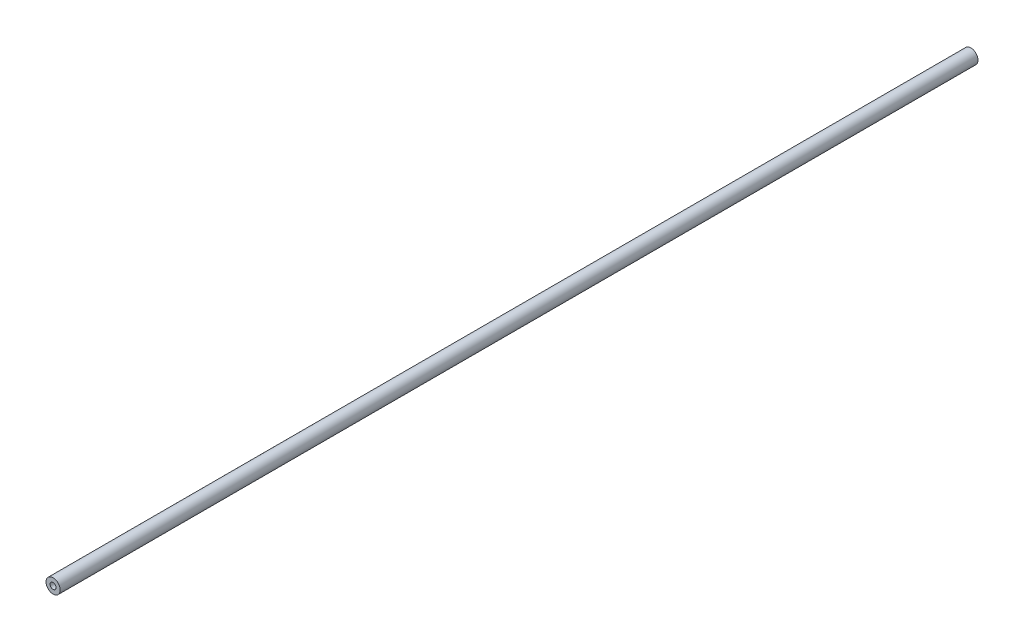
ISO-10303-21;
HEADER;
FILE_DESCRIPTION(('STEP AP214'),'2;1');
FILE_NAME('part.step','',(''),(''),'','','');
FILE_SCHEMA(('AUTOMOTIVE_DESIGN { 1 0 10303 214 1 1 1 1 }'));
ENDSEC;
DATA;
#1=APPLICATION_CONTEXT('core data for automotive mechanical design processes');
#2=APPLICATION_PROTOCOL_DEFINITION('international standard','automotive_design',2000,#1);
#3=PRODUCT_CONTEXT('',#1,'mechanical');
#4=PRODUCT('Part','Part','',(#3));
#5=PRODUCT_RELATED_PRODUCT_CATEGORY('part','',(#4));
#6=PRODUCT_DEFINITION_FORMATION('','',#4);
#7=PRODUCT_DEFINITION_CONTEXT('part definition',#1,'design');
#8=PRODUCT_DEFINITION('design','',#6,#7);
#9=PRODUCT_DEFINITION_SHAPE('','',#8);
#10=(LENGTH_UNIT() NAMED_UNIT(*) SI_UNIT(.MILLI.,.METRE.));
#11=(NAMED_UNIT(*) PLANE_ANGLE_UNIT() SI_UNIT($,.RADIAN.));
#12=(NAMED_UNIT(*) SI_UNIT($,.STERADIAN.) SOLID_ANGLE_UNIT());
#13=UNCERTAINTY_MEASURE_WITH_UNIT(LENGTH_MEASURE(1.E-05),#10,'distance_accuracy_value','');
#14=(GEOMETRIC_REPRESENTATION_CONTEXT(3) GLOBAL_UNCERTAINTY_ASSIGNED_CONTEXT((#13)) GLOBAL_UNIT_ASSIGNED_CONTEXT((#10,
#11,#12)) REPRESENTATION_CONTEXT('',''));
#15=CARTESIAN_POINT('',(0.,0.,0.));
#16=DIRECTION('',(0.,0.,1.));
#17=DIRECTION('',(1.,0.,0.));
#18=AXIS2_PLACEMENT_3D('',#15,#16,#17);
#19=CARTESIAN_POINT('',(0.,0.,-615.95));
#20=DIRECTION('',(0.,0.,1.));
#21=DIRECTION('',(1.,0.,0.));
#22=AXIS2_PLACEMENT_3D('',#19,#20,#21);
#23=PLANE('',#22);
#24=CARTESIAN_POINT('',(0.,0.,-615.95));
#25=DIRECTION('',(0.,0.,1.));
#26=DIRECTION('',(1.,0.,0.));
#27=AXIS2_PLACEMENT_3D('',#24,#25,#26);
#28=CIRCLE('',#27,4.7625);
#29=CARTESIAN_POINT('',(4.7625,0.,-615.95));
#30=VERTEX_POINT('',#29);
#31=EDGE_CURVE('E11',#30,#30,#28,.T.);
#32=ORIENTED_EDGE('',*,*,#31,.F.);
#33=EDGE_LOOP('',(#32));
#34=FACE_BOUND('',#33,.T.);
#35=CARTESIAN_POINT('',(0.,0.,-615.95));
#36=DIRECTION('',(0.,0.,-1.));
#37=DIRECTION('',(-1.,0.,0.));
#38=AXIS2_PLACEMENT_3D('',#35,#36,#37);
#39=CIRCLE('',#38,2.0193);
#40=CARTESIAN_POINT('',(-2.0193,0.,-615.95));
#41=VERTEX_POINT('',#40);
#42=EDGE_CURVE('E81',#41,#41,#39,.T.);
#43=ORIENTED_EDGE('',*,*,#42,.F.);
#44=EDGE_LOOP('',(#43));
#45=FACE_BOUND('',#44,.T.);
#46=ADVANCED_FACE('F55',(#34,#45),#23,.F.);
#47=CARTESIAN_POINT('',(0.,0.,-615.95));
#48=DIRECTION('',(0.,0.,1.));
#49=DIRECTION('',(1.,0.,0.));
#50=AXIS2_PLACEMENT_3D('',#47,#48,#49);
#51=CYLINDRICAL_SURFACE('',#50,4.7625);
#52=ORIENTED_EDGE('',*,*,#31,.T.);
#53=EDGE_LOOP('',(#52));
#54=FACE_BOUND('',#53,.T.);
#55=CARTESIAN_POINT('',(0.,0.,0.));
#56=DIRECTION('',(0.,0.,1.));
#57=DIRECTION('',(1.,0.,0.));
#58=AXIS2_PLACEMENT_3D('',#55,#56,#57);
#59=CIRCLE('',#58,4.7625);
#60=CARTESIAN_POINT('',(4.7625,0.,0.));
#61=VERTEX_POINT('',#60);
#62=EDGE_CURVE('E59',#61,#61,#59,.T.);
#63=ORIENTED_EDGE('',*,*,#62,.F.);
#64=EDGE_LOOP('',(#63));
#65=FACE_BOUND('',#64,.T.);
#66=ADVANCED_FACE('F57',(#54,#65),#51,.T.);
#67=CARTESIAN_POINT('',(0.,0.,0.));
#68=DIRECTION('',(0.,0.,1.));
#69=DIRECTION('',(1.,0.,0.));
#70=AXIS2_PLACEMENT_3D('',#67,#68,#69);
#71=PLANE('',#70);
#72=CARTESIAN_POINT('',(0.,0.,0.));
#73=DIRECTION('',(0.,0.,1.));
#74=DIRECTION('',(1.,0.,0.));
#75=AXIS2_PLACEMENT_3D('',#72,#73,#74);
#76=CIRCLE('',#75,2.0193);
#77=CARTESIAN_POINT('',(2.0193,0.,0.));
#78=VERTEX_POINT('',#77);
#79=EDGE_CURVE('E82',#78,#78,#76,.T.);
#80=ORIENTED_EDGE('',*,*,#79,.F.);
#81=EDGE_LOOP('',(#80));
#82=FACE_BOUND('',#81,.T.);
#83=ORIENTED_EDGE('',*,*,#62,.T.);
#84=EDGE_LOOP('',(#83));
#85=FACE_BOUND('',#84,.T.);
#86=ADVANCED_FACE('F100',(#82,#85),#71,.T.);
#87=CARTESIAN_POINT('',(0.,0.,-596.9));
#88=DIRECTION('',(0.,0.,-1.));
#89=DIRECTION('',(-1.,0.,0.));
#90=AXIS2_PLACEMENT_3D('',#87,#88,#89);
#91=CONICAL_SURFACE('',#90,2.0193,1.02974425867664);
#92=CARTESIAN_POINT('',(0.,0.,-595.686682151998));
#93=VERTEX_POINT('',#92);
#94=VERTEX_LOOP('',#93);
#95=FACE_BOUND('',#94,.T.);
#96=CARTESIAN_POINT('',(0.,0.,-596.9));
#97=DIRECTION('',(0.,0.,-1.));
#98=DIRECTION('',(-1.,0.,0.));
#99=AXIS2_PLACEMENT_3D('',#96,#97,#98);
#100=CIRCLE('',#99,2.0193);
#101=CARTESIAN_POINT('',(-2.0193,0.,-596.9));
#102=VERTEX_POINT('',#101);
#103=EDGE_CURVE('E87',#102,#102,#100,.T.);
#104=ORIENTED_EDGE('',*,*,#103,.T.);
#105=EDGE_LOOP('',(#104));
#106=FACE_BOUND('',#105,.T.);
#107=ADVANCED_FACE('F108',(#95,#106),#91,.F.);
#108=CARTESIAN_POINT('',(0.,0.,-615.95));
#109=DIRECTION('',(0.,0.,-1.));
#110=DIRECTION('',(-1.,0.,0.));
#111=AXIS2_PLACEMENT_3D('',#108,#109,#110);
#112=CYLINDRICAL_SURFACE('',#111,2.0193);
#113=ORIENTED_EDGE('',*,*,#103,.F.);
#114=EDGE_LOOP('',(#113));
#115=FACE_BOUND('',#114,.T.);
#116=ORIENTED_EDGE('',*,*,#42,.T.);
#117=EDGE_LOOP('',(#116));
#118=FACE_BOUND('',#117,.T.);
#119=ADVANCED_FACE('F74',(#115,#118),#112,.F.);
#120=CARTESIAN_POINT('',(0.,0.,-19.05));
#121=DIRECTION('',(0.,0.,1.));
#122=DIRECTION('',(1.,0.,0.));
#123=AXIS2_PLACEMENT_3D('',#120,#121,#122);
#124=CONICAL_SURFACE('',#123,2.0193,1.02974425867665);
#125=CARTESIAN_POINT('',(0.,0.,-20.2633178480024));
#126=VERTEX_POINT('',#125);
#127=VERTEX_LOOP('',#126);
#128=FACE_BOUND('',#127,.T.);
#129=CARTESIAN_POINT('',(0.,0.,-19.05));
#130=DIRECTION('',(0.,0.,1.));
#131=DIRECTION('',(1.,0.,0.));
#132=AXIS2_PLACEMENT_3D('',#129,#130,#131);
#133=CIRCLE('',#132,2.0193);
#134=CARTESIAN_POINT('',(2.0193,0.,-19.05));
#135=VERTEX_POINT('',#134);
#136=EDGE_CURVE('E78',#135,#135,#133,.T.);
#137=ORIENTED_EDGE('',*,*,#136,.T.);
#138=EDGE_LOOP('',(#137));
#139=FACE_BOUND('',#138,.T.);
#140=ADVANCED_FACE('F70',(#128,#139),#124,.F.);
#141=CARTESIAN_POINT('',(0.,0.,0.));
#142=DIRECTION('',(0.,0.,1.));
#143=DIRECTION('',(1.,0.,0.));
#144=AXIS2_PLACEMENT_3D('',#141,#142,#143);
#145=CYLINDRICAL_SURFACE('',#144,2.0193);
#146=ORIENTED_EDGE('',*,*,#136,.F.);
#147=EDGE_LOOP('',(#146));
#148=FACE_BOUND('',#147,.T.);
#149=ORIENTED_EDGE('',*,*,#79,.T.);
#150=EDGE_LOOP('',(#149));
#151=FACE_BOUND('',#150,.T.);
#152=ADVANCED_FACE('F73',(#148,#151),#145,.F.);
#153=CLOSED_SHELL('',(#46,#66,#86,#107,#119,#140,#152));
#154=MANIFOLD_SOLID_BREP('B2',#153);
#155=ADVANCED_BREP_SHAPE_REPRESENTATION('',(#18,#154),#14);
#156=SHAPE_DEFINITION_REPRESENTATION(#9,#155);
ENDSEC;
END-ISO-10303-21;
